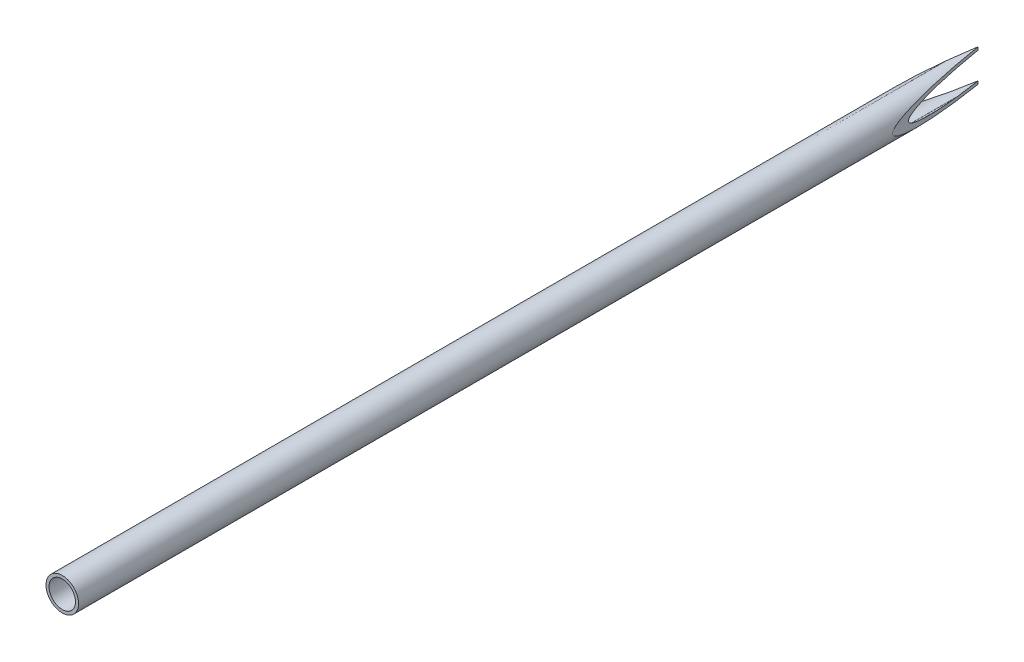
ISO-10303-21;
HEADER;
FILE_DESCRIPTION(('STEP AP214'),'2;1');
FILE_NAME('part.step','',(''),(''),'','','');
FILE_SCHEMA(('AUTOMOTIVE_DESIGN { 1 0 10303 214 1 1 1 1 }'));
ENDSEC;
DATA;
#1=APPLICATION_CONTEXT('core data for automotive mechanical design processes');
#2=APPLICATION_PROTOCOL_DEFINITION('international standard','automotive_design',2000,#1);
#3=PRODUCT_CONTEXT('',#1,'mechanical');
#4=PRODUCT('Part','Part','',(#3));
#5=PRODUCT_RELATED_PRODUCT_CATEGORY('part','',(#4));
#6=PRODUCT_DEFINITION_FORMATION('','',#4);
#7=PRODUCT_DEFINITION_CONTEXT('part definition',#1,'design');
#8=PRODUCT_DEFINITION('design','',#6,#7);
#9=PRODUCT_DEFINITION_SHAPE('','',#8);
#10=(LENGTH_UNIT() NAMED_UNIT(*) SI_UNIT(.MILLI.,.METRE.));
#11=(NAMED_UNIT(*) PLANE_ANGLE_UNIT() SI_UNIT($,.RADIAN.));
#12=(NAMED_UNIT(*) SI_UNIT($,.STERADIAN.) SOLID_ANGLE_UNIT());
#13=UNCERTAINTY_MEASURE_WITH_UNIT(LENGTH_MEASURE(1.E-05),#10,'distance_accuracy_value','');
#14=(GEOMETRIC_REPRESENTATION_CONTEXT(3) GLOBAL_UNCERTAINTY_ASSIGNED_CONTEXT((#13)) GLOBAL_UNIT_ASSIGNED_CONTEXT((#10,
#11,#12)) REPRESENTATION_CONTEXT('',''));
#15=CARTESIAN_POINT('',(0.,0.,0.));
#16=DIRECTION('',(0.,0.,1.));
#17=DIRECTION('',(1.,0.,0.));
#18=AXIS2_PLACEMENT_3D('',#15,#16,#17);
#19=CARTESIAN_POINT('',(0.,0.,900.));
#20=DIRECTION('',(0.,0.,1.));
#21=DIRECTION('',(1.,0.,0.));
#22=AXIS2_PLACEMENT_3D('',#19,#20,#21);
#23=PLANE('',#22);
#24=CARTESIAN_POINT('',(0.,0.,900.));
#25=DIRECTION('',(0.,0.,1.));
#26=DIRECTION('',(1.,0.,0.));
#27=AXIS2_PLACEMENT_3D('',#24,#25,#26);
#28=CIRCLE('',#27,16.);
#29=CARTESIAN_POINT('',(16.,0.,900.));
#30=VERTEX_POINT('',#29);
#31=EDGE_CURVE('E41',#30,#30,#28,.T.);
#32=ORIENTED_EDGE('',*,*,#31,.T.);
#33=EDGE_LOOP('',(#32));
#34=FACE_BOUND('',#33,.T.);
#35=CARTESIAN_POINT('',(0.,0.,900.));
#36=DIRECTION('',(0.,0.,1.));
#37=DIRECTION('',(1.,0.,0.));
#38=AXIS2_PLACEMENT_3D('',#35,#36,#37);
#39=CIRCLE('',#38,13.);
#40=CARTESIAN_POINT('',(13.,0.,900.));
#41=VERTEX_POINT('',#40);
#42=EDGE_CURVE('E70',#41,#41,#39,.T.);
#43=ORIENTED_EDGE('',*,*,#42,.F.);
#44=EDGE_LOOP('',(#43));
#45=FACE_BOUND('',#44,.T.);
#46=ADVANCED_FACE('F33',(#34,#45),#23,.T.);
#47=CARTESIAN_POINT('',(0.,0.,900.));
#48=DIRECTION('',(0.,0.,-1.));
#49=DIRECTION('',(-1.,0.,0.));
#50=AXIS2_PLACEMENT_3D('',#47,#48,#49);
#51=CYLINDRICAL_SURFACE('',#50,16.);
#52=ORIENTED_EDGE('',*,*,#31,.F.);
#53=EDGE_LOOP('',(#52));
#54=FACE_BOUND('',#53,.T.);
#55=CARTESIAN_POINT('',(0.,0.,1.11022302462516E-13));
#56=DIRECTION('',(-0.987440631916705,0.,0.157990501106673));
#57=DIRECTION('',(-0.157990501106673,0.,-0.987440631916705));
#58=AXIS2_PLACEMENT_3D('',#55,#56,#57);
#59=ELLIPSE('',#58,101.271911209377,16.);
#60=CARTESIAN_POINT('',(0.,-16.,0.));
#61=VERTEX_POINT('',#60);
#62=CARTESIAN_POINT('',(0.,16.,0.));
#63=VERTEX_POINT('',#62);
#64=EDGE_CURVE('E60',#61,#63,#59,.T.);
#65=ORIENTED_EDGE('',*,*,#64,.T.);
#66=CARTESIAN_POINT('',(0.,0.,1.11022302462516E-13));
#67=DIRECTION('',(0.987440631916705,0.,0.157990501106673));
#68=DIRECTION('',(0.157990501106673,0.,-0.987440631916705));
#69=AXIS2_PLACEMENT_3D('',#66,#67,#68);
#70=ELLIPSE('',#69,101.271911209377,16.);
#71=EDGE_CURVE('E48',#63,#61,#70,.T.);
#72=ORIENTED_EDGE('',*,*,#71,.T.);
#73=EDGE_LOOP('',(#65,#72));
#74=FACE_BOUND('',#73,.T.);
#75=ADVANCED_FACE('F35',(#54,#74),#51,.T.);
#76=CARTESIAN_POINT('',(0.,0.,900.));
#77=DIRECTION('',(0.,0.,-1.));
#78=DIRECTION('',(-1.,0.,0.));
#79=AXIS2_PLACEMENT_3D('',#76,#77,#78);
#80=CYLINDRICAL_SURFACE('',#79,13.);
#81=CARTESIAN_POINT('',(0.,0.,1.11022302462516E-13));
#82=DIRECTION('',(0.987440631916705,0.,0.157990501106673));
#83=DIRECTION('',(0.157990501106673,0.,-0.987440631916705));
#84=AXIS2_PLACEMENT_3D('',#81,#82,#83);
#85=ELLIPSE('',#84,82.2834278576191,13.);
#86=CARTESIAN_POINT('',(0.,13.,0.));
#87=VERTEX_POINT('',#86);
#88=CARTESIAN_POINT('',(0.,-13.,0.));
#89=VERTEX_POINT('',#88);
#90=EDGE_CURVE('E61',#87,#89,#85,.T.);
#91=ORIENTED_EDGE('',*,*,#90,.F.);
#92=CARTESIAN_POINT('',(0.,0.,1.11022302462516E-13));
#93=DIRECTION('',(-0.987440631916705,0.,0.157990501106673));
#94=DIRECTION('',(-0.157990501106673,0.,-0.987440631916705));
#95=AXIS2_PLACEMENT_3D('',#92,#93,#94);
#96=ELLIPSE('',#95,82.2834278576191,13.);
#97=EDGE_CURVE('E11',#89,#87,#96,.T.);
#98=ORIENTED_EDGE('',*,*,#97,.F.);
#99=EDGE_LOOP('',(#91,#98));
#100=FACE_BOUND('',#99,.T.);
#101=ORIENTED_EDGE('',*,*,#42,.T.);
#102=EDGE_LOOP('',(#101));
#103=FACE_BOUND('',#102,.T.);
#104=ADVANCED_FACE('F80',(#100,#103),#80,.F.);
#105=CARTESIAN_POINT('',(0.,-16.,0.));
#106=DIRECTION('',(-0.987440631916705,0.,0.157990501106673));
#107=DIRECTION('',(0.157990501106673,0.,0.987440631916705));
#108=AXIS2_PLACEMENT_3D('',#105,#106,#107);
#109=PLANE('',#108);
#110=DIRECTION('',(0.,1.,0.));
#111=VECTOR('',#110,1.);
#112=CARTESIAN_POINT('',(0.,-16.,0.));
#113=LINE('',#112,#111);
#114=EDGE_CURVE('E64',#61,#89,#113,.T.);
#115=ORIENTED_EDGE('',*,*,#114,.T.);
#116=ORIENTED_EDGE('',*,*,#97,.T.);
#117=EDGE_CURVE('E53',#87,#63,#113,.T.);
#118=ORIENTED_EDGE('',*,*,#117,.T.);
#119=ORIENTED_EDGE('',*,*,#64,.F.);
#120=EDGE_LOOP('',(#115,#116,#118,#119));
#121=FACE_BOUND('',#120,.T.);
#122=ADVANCED_FACE('F69',(#121),#109,.F.);
#123=CARTESIAN_POINT('',(0.,-16.,0.));
#124=DIRECTION('',(0.987440631916705,0.,0.157990501106673));
#125=DIRECTION('',(0.157990501106673,0.,-0.987440631916705));
#126=AXIS2_PLACEMENT_3D('',#123,#124,#125);
#127=PLANE('',#126);
#128=ORIENTED_EDGE('',*,*,#117,.F.);
#129=ORIENTED_EDGE('',*,*,#90,.T.);
#130=ORIENTED_EDGE('',*,*,#114,.F.);
#131=ORIENTED_EDGE('',*,*,#71,.F.);
#132=EDGE_LOOP('',(#128,#129,#130,#131));
#133=FACE_BOUND('',#132,.T.);
#134=ADVANCED_FACE('F65',(#133),#127,.F.);
#135=CLOSED_SHELL('',(#46,#75,#104,#122,#134));
#136=MANIFOLD_SOLID_BREP('B2',#135);
#137=ADVANCED_BREP_SHAPE_REPRESENTATION('',(#18,#136),#14);
#138=SHAPE_DEFINITION_REPRESENTATION(#9,#137);
ENDSEC;
END-ISO-10303-21;
